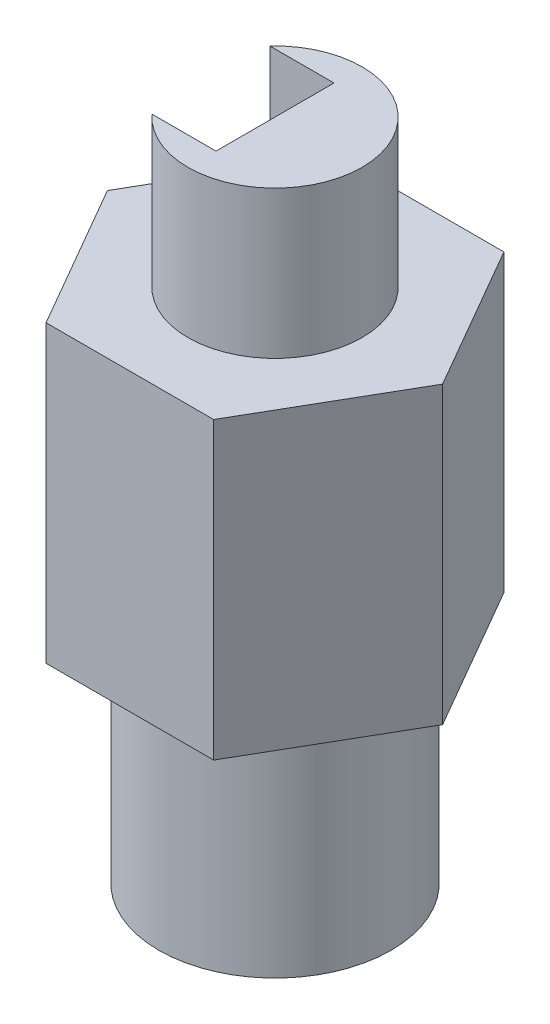
ISO-10303-21;
HEADER;
FILE_DESCRIPTION(('STEP AP214'),'2;1');
FILE_NAME('part.step','',(''),(''),'','','');
FILE_SCHEMA(('AUTOMOTIVE_DESIGN { 1 0 10303 214 1 1 1 1 }'));
ENDSEC;
DATA;
#1=APPLICATION_CONTEXT('core data for automotive mechanical design processes');
#2=APPLICATION_PROTOCOL_DEFINITION('international standard','automotive_design',2000,#1);
#3=PRODUCT_CONTEXT('',#1,'mechanical');
#4=PRODUCT('Part','Part','',(#3));
#5=PRODUCT_RELATED_PRODUCT_CATEGORY('part','',(#4));
#6=PRODUCT_DEFINITION_FORMATION('','',#4);
#7=PRODUCT_DEFINITION_CONTEXT('part definition',#1,'design');
#8=PRODUCT_DEFINITION('design','',#6,#7);
#9=PRODUCT_DEFINITION_SHAPE('','',#8);
#10=(LENGTH_UNIT() NAMED_UNIT(*) SI_UNIT(.MILLI.,.METRE.));
#11=(NAMED_UNIT(*) PLANE_ANGLE_UNIT() SI_UNIT($,.RADIAN.));
#12=(NAMED_UNIT(*) SI_UNIT($,.STERADIAN.) SOLID_ANGLE_UNIT());
#13=UNCERTAINTY_MEASURE_WITH_UNIT(LENGTH_MEASURE(1.E-05),#10,'distance_accuracy_value','');
#14=(GEOMETRIC_REPRESENTATION_CONTEXT(3) GLOBAL_UNCERTAINTY_ASSIGNED_CONTEXT((#13)) GLOBAL_UNIT_ASSIGNED_CONTEXT((#10,
#11,#12)) REPRESENTATION_CONTEXT('',''));
#15=CARTESIAN_POINT('',(0.,0.,0.));
#16=DIRECTION('',(0.,0.,1.));
#17=DIRECTION('',(1.,0.,0.));
#18=AXIS2_PLACEMENT_3D('',#15,#16,#17);
#19=CARTESIAN_POINT('',(2.88675134594813,25.6402523165195,5.));
#20=DIRECTION('',(-0.866025403784439,0.,-0.5));
#21=DIRECTION('',(-0.5,0.,0.866025403784439));
#22=AXIS2_PLACEMENT_3D('',#19,#20,#21);
#23=PLANE('',#22);
#24=DIRECTION('',(-0.5,0.,0.866025403784439));
#25=VECTOR('',#24,1.);
#26=CARTESIAN_POINT('',(2.88675134594813,5.285,5.));
#27=LINE('',#26,#25);
#28=CARTESIAN_POINT('',(5.77350269189626,5.285,0.));
#29=VERTEX_POINT('',#28);
#30=CARTESIAN_POINT('',(2.88675134594813,5.285,5.));
#31=VERTEX_POINT('',#30);
#32=EDGE_CURVE('E192',#29,#31,#27,.T.);
#33=ORIENTED_EDGE('',*,*,#32,.T.);
#34=DIRECTION('',(0.,-1.,0.));
#35=VECTOR('',#34,1.);
#36=CARTESIAN_POINT('',(2.88675134594813,25.6402523165195,5.));
#37=LINE('',#36,#35);
#38=CARTESIAN_POINT('',(2.88675134594813,-4.875,5.));
#39=VERTEX_POINT('',#38);
#40=EDGE_CURVE('E224',#31,#39,#37,.T.);
#41=ORIENTED_EDGE('',*,*,#40,.T.);
#42=DIRECTION('',(-0.5,0.,0.866025403784439));
#43=VECTOR('',#42,1.);
#44=CARTESIAN_POINT('',(2.88675134594813,-4.875,5.));
#45=LINE('',#44,#43);
#46=CARTESIAN_POINT('',(5.77350269189626,-4.875,0.));
#47=VERTEX_POINT('',#46);
#48=EDGE_CURVE('E218',#47,#39,#45,.T.);
#49=ORIENTED_EDGE('',*,*,#48,.F.);
#50=DIRECTION('',(0.,-1.,0.));
#51=VECTOR('',#50,1.);
#52=CARTESIAN_POINT('',(5.77350269189626,25.6402523165195,0.));
#53=LINE('',#52,#51);
#54=EDGE_CURVE('E225',#29,#47,#53,.T.);
#55=ORIENTED_EDGE('',*,*,#54,.F.);
#56=EDGE_LOOP('',(#33,#41,#49,#55));
#57=FACE_BOUND('',#56,.T.);
#58=ADVANCED_FACE('F47',(#57),#23,.F.);
#59=CARTESIAN_POINT('',(5.77350269189626,25.6402523165195,0.));
#60=DIRECTION('',(-0.866025403784438,0.,0.5));
#61=DIRECTION('',(0.5,0.,0.866025403784439));
#62=AXIS2_PLACEMENT_3D('',#59,#60,#61);
#63=PLANE('',#62);
#64=DIRECTION('',(0.5,0.,0.866025403784439));
#65=VECTOR('',#64,1.);
#66=CARTESIAN_POINT('',(5.77350269189626,5.285,0.));
#67=LINE('',#66,#65);
#68=CARTESIAN_POINT('',(2.88675134594813,5.285,-5.));
#69=VERTEX_POINT('',#68);
#70=EDGE_CURVE('E198',#69,#29,#67,.T.);
#71=ORIENTED_EDGE('',*,*,#70,.T.);
#72=ORIENTED_EDGE('',*,*,#54,.T.);
#73=DIRECTION('',(0.5,0.,0.866025403784439));
#74=VECTOR('',#73,1.);
#75=CARTESIAN_POINT('',(5.77350269189626,-4.875,0.));
#76=LINE('',#75,#74);
#77=CARTESIAN_POINT('',(2.88675134594813,-4.875,-5.));
#78=VERTEX_POINT('',#77);
#79=EDGE_CURVE('E221',#78,#47,#76,.T.);
#80=ORIENTED_EDGE('',*,*,#79,.F.);
#81=DIRECTION('',(0.,-1.,0.));
#82=VECTOR('',#81,1.);
#83=CARTESIAN_POINT('',(2.88675134594813,25.6402523165195,-5.));
#84=LINE('',#83,#82);
#85=EDGE_CURVE('E227',#69,#78,#84,.T.);
#86=ORIENTED_EDGE('',*,*,#85,.F.);
#87=EDGE_LOOP('',(#71,#72,#80,#86));
#88=FACE_BOUND('',#87,.T.);
#89=ADVANCED_FACE('F262',(#88),#63,.F.);
#90=CARTESIAN_POINT('',(2.88675134594813,25.6402523165195,-5.));
#91=DIRECTION('',(0.,0.,1.));
#92=DIRECTION('',(1.,0.,0.));
#93=AXIS2_PLACEMENT_3D('',#90,#91,#92);
#94=PLANE('',#93);
#95=DIRECTION('',(1.,0.,0.));
#96=VECTOR('',#95,1.);
#97=CARTESIAN_POINT('',(2.88675134594813,5.285,-5.));
#98=LINE('',#97,#96);
#99=CARTESIAN_POINT('',(-2.88675134594813,5.285,-5.));
#100=VERTEX_POINT('',#99);
#101=EDGE_CURVE('E201',#100,#69,#98,.T.);
#102=ORIENTED_EDGE('',*,*,#101,.T.);
#103=ORIENTED_EDGE('',*,*,#85,.T.);
#104=DIRECTION('',(1.,0.,0.));
#105=VECTOR('',#104,1.);
#106=CARTESIAN_POINT('',(2.88675134594813,-4.875,-5.));
#107=LINE('',#106,#105);
#108=CARTESIAN_POINT('',(-2.88675134594813,-4.875,-5.));
#109=VERTEX_POINT('',#108);
#110=EDGE_CURVE('E195',#109,#78,#107,.T.);
#111=ORIENTED_EDGE('',*,*,#110,.F.);
#112=DIRECTION('',(0.,-1.,0.));
#113=VECTOR('',#112,1.);
#114=CARTESIAN_POINT('',(-2.88675134594813,25.6402523165195,-5.));
#115=LINE('',#114,#113);
#116=EDGE_CURVE('E229',#100,#109,#115,.T.);
#117=ORIENTED_EDGE('',*,*,#116,.F.);
#118=EDGE_LOOP('',(#102,#103,#111,#117));
#119=FACE_BOUND('',#118,.T.);
#120=ADVANCED_FACE('F268',(#119),#94,.F.);
#121=CARTESIAN_POINT('',(-2.88675134594813,25.6402523165195,-5.));
#122=DIRECTION('',(0.866025403784438,0.,0.5));
#123=DIRECTION('',(0.5,0.,-0.866025403784439));
#124=AXIS2_PLACEMENT_3D('',#121,#122,#123);
#125=PLANE('',#124);
#126=DIRECTION('',(0.5,0.,-0.866025403784439));
#127=VECTOR('',#126,1.);
#128=CARTESIAN_POINT('',(-2.88675134594813,5.285,-5.));
#129=LINE('',#128,#127);
#130=CARTESIAN_POINT('',(-5.77350269189626,5.285,0.));
#131=VERTEX_POINT('',#130);
#132=EDGE_CURVE('E204',#131,#100,#129,.T.);
#133=ORIENTED_EDGE('',*,*,#132,.T.);
#134=ORIENTED_EDGE('',*,*,#116,.T.);
#135=DIRECTION('',(0.5,0.,-0.866025403784439));
#136=VECTOR('',#135,1.);
#137=CARTESIAN_POINT('',(-2.88675134594813,-4.875,-5.));
#138=LINE('',#137,#136);
#139=CARTESIAN_POINT('',(-5.77350269189626,-4.875,0.));
#140=VERTEX_POINT('',#139);
#141=EDGE_CURVE('E209',#140,#109,#138,.T.);
#142=ORIENTED_EDGE('',*,*,#141,.F.);
#143=DIRECTION('',(0.,-1.,0.));
#144=VECTOR('',#143,1.);
#145=CARTESIAN_POINT('',(-5.77350269189626,25.6402523165195,0.));
#146=LINE('',#145,#144);
#147=EDGE_CURVE('E231',#131,#140,#146,.T.);
#148=ORIENTED_EDGE('',*,*,#147,.F.);
#149=EDGE_LOOP('',(#133,#134,#142,#148));
#150=FACE_BOUND('',#149,.T.);
#151=ADVANCED_FACE('F274',(#150),#125,.F.);
#152=CARTESIAN_POINT('',(-5.77350269189626,25.6402523165195,0.));
#153=DIRECTION('',(0.866025403784439,0.,-0.5));
#154=DIRECTION('',(-0.5,0.,-0.866025403784439));
#155=AXIS2_PLACEMENT_3D('',#152,#153,#154);
#156=PLANE('',#155);
#157=DIRECTION('',(-0.5,0.,-0.866025403784439));
#158=VECTOR('',#157,1.);
#159=CARTESIAN_POINT('',(-5.77350269189626,5.285,0.));
#160=LINE('',#159,#158);
#161=CARTESIAN_POINT('',(-2.88675134594813,5.28500000000001,5.));
#162=VERTEX_POINT('',#161);
#163=EDGE_CURVE('E77',#162,#131,#160,.T.);
#164=ORIENTED_EDGE('',*,*,#163,.T.);
#165=ORIENTED_EDGE('',*,*,#147,.T.);
#166=DIRECTION('',(-0.5,0.,-0.866025403784439));
#167=VECTOR('',#166,1.);
#168=CARTESIAN_POINT('',(-5.77350269189626,-4.875,0.));
#169=LINE('',#168,#167);
#170=CARTESIAN_POINT('',(-2.88675134594813,-4.875,5.));
#171=VERTEX_POINT('',#170);
#172=EDGE_CURVE('E212',#171,#140,#169,.T.);
#173=ORIENTED_EDGE('',*,*,#172,.F.);
#174=DIRECTION('',(0.,-1.,0.));
#175=VECTOR('',#174,1.);
#176=CARTESIAN_POINT('',(-2.88675134594813,25.6402523165195,5.));
#177=LINE('',#176,#175);
#178=EDGE_CURVE('E233',#162,#171,#177,.T.);
#179=ORIENTED_EDGE('',*,*,#178,.F.);
#180=EDGE_LOOP('',(#164,#165,#173,#179));
#181=FACE_BOUND('',#180,.T.);
#182=ADVANCED_FACE('F278',(#181),#156,.F.);
#183=CARTESIAN_POINT('',(-2.88675134594813,25.6402523165195,5.));
#184=DIRECTION('',(0.,0.,-1.));
#185=DIRECTION('',(-1.,0.,0.));
#186=AXIS2_PLACEMENT_3D('',#183,#184,#185);
#187=PLANE('',#186);
#188=DIRECTION('',(-1.,0.,0.));
#189=VECTOR('',#188,1.);
#190=CARTESIAN_POINT('',(-2.88675134594813,5.285,5.));
#191=LINE('',#190,#189);
#192=EDGE_CURVE('E193',#31,#162,#191,.T.);
#193=ORIENTED_EDGE('',*,*,#192,.T.);
#194=ORIENTED_EDGE('',*,*,#178,.T.);
#195=DIRECTION('',(-1.,0.,0.));
#196=VECTOR('',#195,1.);
#197=CARTESIAN_POINT('',(-2.88675134594813,-4.875,5.));
#198=LINE('',#197,#196);
#199=EDGE_CURVE('E215',#39,#171,#198,.T.);
#200=ORIENTED_EDGE('',*,*,#199,.F.);
#201=ORIENTED_EDGE('',*,*,#40,.F.);
#202=EDGE_LOOP('',(#193,#194,#200,#201));
#203=FACE_BOUND('',#202,.T.);
#204=ADVANCED_FACE('F282',(#203),#187,.F.);
#205=CARTESIAN_POINT('',(0.,-4.875,0.));
#206=DIRECTION('',(0.,1.,0.));
#207=DIRECTION('',(0.,0.,1.));
#208=AXIS2_PLACEMENT_3D('',#205,#206,#207);
#209=PLANE('',#208);
#210=CARTESIAN_POINT('',(0.,-4.875,0.));
#211=DIRECTION('',(0.,-1.,0.));
#212=DIRECTION('',(0.,0.,-1.));
#213=AXIS2_PLACEMENT_3D('',#210,#211,#212);
#214=CIRCLE('',#213,4.);
#215=CARTESIAN_POINT('',(0.,-4.875,-4.));
#216=VERTEX_POINT('',#215);
#217=EDGE_CURVE('E12',#216,#216,#214,.T.);
#218=ORIENTED_EDGE('',*,*,#217,.F.);
#219=EDGE_LOOP('',(#218));
#220=FACE_BOUND('',#219,.T.);
#221=ORIENTED_EDGE('',*,*,#48,.T.);
#222=ORIENTED_EDGE('',*,*,#199,.T.);
#223=ORIENTED_EDGE('',*,*,#172,.T.);
#224=ORIENTED_EDGE('',*,*,#141,.T.);
#225=ORIENTED_EDGE('',*,*,#110,.T.);
#226=ORIENTED_EDGE('',*,*,#79,.T.);
#227=EDGE_LOOP('',(#221,#222,#223,#224,#225,#226));
#228=FACE_BOUND('',#227,.T.);
#229=ADVANCED_FACE('F286',(#220,#228),#209,.F.);
#230=CARTESIAN_POINT('',(0.,5.285,0.));
#231=DIRECTION('',(0.,1.,0.));
#232=DIRECTION('',(0.,0.,1.));
#233=AXIS2_PLACEMENT_3D('',#230,#231,#232);
#234=PLANE('',#233);
#235=DIRECTION('',(1.,0.,0.));
#236=VECTOR('',#235,1.);
#237=CARTESIAN_POINT('',(-14.1609873410543,5.285,-0.4445));
#238=LINE('',#237,#236);
#239=CARTESIAN_POINT('',(-2.96688721558471,5.285,-0.4445));
#240=VERTEX_POINT('',#239);
#241=CARTESIAN_POINT('',(0.,5.285,-0.4445));
#242=VERTEX_POINT('',#241);
#243=EDGE_CURVE('E180',#240,#242,#238,.T.);
#244=ORIENTED_EDGE('',*,*,#243,.F.);
#245=CARTESIAN_POINT('',(0.,5.285,0.));
#246=DIRECTION('',(0.,1.,0.));
#247=DIRECTION('',(0.,0.,1.));
#248=AXIS2_PLACEMENT_3D('',#245,#246,#247);
#249=CIRCLE('',#248,3.);
#250=CARTESIAN_POINT('',(-2.96688721558471,5.285,0.4445));
#251=VERTEX_POINT('',#250);
#252=EDGE_CURVE('E189',#240,#251,#249,.F.);
#253=ORIENTED_EDGE('',*,*,#252,.T.);
#254=DIRECTION('',(1.,0.,0.));
#255=VECTOR('',#254,1.);
#256=CARTESIAN_POINT('',(-14.1609873410543,5.285,0.4445));
#257=LINE('',#256,#255);
#258=CARTESIAN_POINT('',(0.,5.285,0.4445));
#259=VERTEX_POINT('',#258);
#260=EDGE_CURVE('E152',#251,#259,#257,.T.);
#261=ORIENTED_EDGE('',*,*,#260,.T.);
#262=DIRECTION('',(0.,0.,-1.));
#263=VECTOR('',#262,1.);
#264=CARTESIAN_POINT('',(0.,5.285,0.4445));
#265=LINE('',#264,#263);
#266=EDGE_CURVE('E159',#259,#242,#265,.T.);
#267=ORIENTED_EDGE('',*,*,#266,.T.);
#268=EDGE_LOOP('',(#244,#253,#261,#267));
#269=FACE_BOUND('',#268,.T.);
#270=ORIENTED_EDGE('',*,*,#101,.F.);
#271=ORIENTED_EDGE('',*,*,#132,.F.);
#272=ORIENTED_EDGE('',*,*,#163,.F.);
#273=ORIENTED_EDGE('',*,*,#192,.F.);
#274=ORIENTED_EDGE('',*,*,#32,.F.);
#275=ORIENTED_EDGE('',*,*,#70,.F.);
#276=EDGE_LOOP('',(#270,#271,#272,#273,#274,#275));
#277=FACE_BOUND('',#276,.T.);
#278=ADVANCED_FACE('F289',(#269,#277),#234,.T.);
#279=CARTESIAN_POINT('',(0.,-8.1712496598124,0.));
#280=DIRECTION('',(0.,1.,0.));
#281=DIRECTION('',(0.,0.,1.));
#282=AXIS2_PLACEMENT_3D('',#279,#280,#281);
#283=CYLINDRICAL_SURFACE('',#282,3.);
#284=DIRECTION('',(0.,1.,0.));
#285=VECTOR('',#284,1.);
#286=CARTESIAN_POINT('',(-2.20702877190127,-8.1712496598124,-2.032));
#287=LINE('',#286,#285);
#288=CARTESIAN_POINT('',(-2.20702877190126,10.365,-2.032));
#289=VERTEX_POINT('',#288);
#290=CARTESIAN_POINT('',(-2.20702877190126,6.8725,-2.032));
#291=VERTEX_POINT('',#290);
#292=EDGE_CURVE('E179',#289,#291,#287,.F.);
#293=ORIENTED_EDGE('',*,*,#292,.F.);
#294=CARTESIAN_POINT('',(0.,10.365,0.));
#295=DIRECTION('',(0.,1.,0.));
#296=DIRECTION('',(0.,0.,1.));
#297=AXIS2_PLACEMENT_3D('',#294,#295,#296);
#298=CIRCLE('',#297,3.);
#299=CARTESIAN_POINT('',(-2.20702877190126,10.365,2.032));
#300=VERTEX_POINT('',#299);
#301=EDGE_CURVE('E186',#300,#289,#298,.T.);
#302=ORIENTED_EDGE('',*,*,#301,.F.);
#303=DIRECTION('',(0.,1.,0.));
#304=VECTOR('',#303,1.);
#305=CARTESIAN_POINT('',(-2.20702877190127,-8.1712496598124,2.032));
#306=LINE('',#305,#304);
#307=CARTESIAN_POINT('',(-2.20702877190126,6.8725,2.032));
#308=VERTEX_POINT('',#307);
#309=EDGE_CURVE('E184',#308,#300,#306,.T.);
#310=ORIENTED_EDGE('',*,*,#309,.F.);
#311=CARTESIAN_POINT('',(-2.96688721558471,5.285,0.4445));
#312=CARTESIAN_POINT('',(-2.96037160571193,5.28499314321017,0.488047958183646));
#313=CARTESIAN_POINT('',(-2.95288210331069,5.28679152477945,0.531438293995322));
#314=CARTESIAN_POINT('',(-2.93607693229879,5.29387063793157,0.617544516347396));
#315=CARTESIAN_POINT('',(-2.9267626239757,5.29914878244151,0.660260879821429));
#316=CARTESIAN_POINT('',(-2.90648171091925,5.31301707699284,0.744467051704167));
#317=CARTESIAN_POINT('',(-2.89552557086391,5.32158675267863,0.785962768212767));
#318=CARTESIAN_POINT('',(-2.87208290461378,5.3418757503602,0.86772779369421));
#319=CARTESIAN_POINT('',(-2.85959613614175,5.35359557133136,0.907996907250129));
#320=CARTESIAN_POINT('',(-2.82018014200765,5.39315375440561,1.02638530887571));
#321=CARTESIAN_POINT('',(-2.79121968521532,5.425443193895,1.10239241300957));
#322=CARTESIAN_POINT('',(-2.72951488849794,5.50056193830292,1.24739265312568));
#323=CARTESIAN_POINT('',(-2.69676417202573,5.54340914590722,1.31637359114929));
#324=CARTESIAN_POINT('',(-2.62572298371631,5.64352543737428,1.45331747729901));
#325=CARTESIAN_POINT('',(-2.58721282023722,5.70184002291133,1.52040266022815));
#326=CARTESIAN_POINT('',(-2.51043315275164,5.82894135635848,1.64408869494391));
#327=CARTESIAN_POINT('',(-2.47216385108591,5.89773593199723,1.70068163921428));
#328=CARTESIAN_POINT('',(-2.40284177344059,6.03755360379438,1.79708344075738));
#329=CARTESIAN_POINT('',(-2.37145107440373,6.10763341134616,1.83801555945345));
#330=CARTESIAN_POINT('',(-2.3144910613003,6.25498326020619,1.90924294261172));
#331=CARTESIAN_POINT('',(-2.28889820173753,6.33222235657709,1.93958151058721));
#332=CARTESIAN_POINT('',(-2.25834498290293,6.44872659168773,1.97486451719009));
#333=CARTESIAN_POINT('',(-2.24975854848329,6.48563840539848,1.98461954942514));
#334=CARTESIAN_POINT('',(-2.23474657427793,6.560487364588,2.00150812184035));
#335=CARTESIAN_POINT('',(-2.22832023800933,6.59842412655567,2.00864262836488));
#336=CARTESIAN_POINT('',(-2.21783788901163,6.67547980453833,2.0202130412461));
#337=CARTESIAN_POINT('',(-2.21380940169504,6.71460722440402,2.02461763316284));
#338=CARTESIAN_POINT('',(-2.20839226961138,6.79331798798068,2.03051890476745));
#339=CARTESIAN_POINT('',(-2.20700751443488,6.83290191739001,2.03201129995741));
#340=CARTESIAN_POINT('',(-2.20702877190126,6.8725,2.032));
#341=B_SPLINE_CURVE_WITH_KNOTS('',3,(#311,#312,#313,#314,#315,#316,#317,#318,#319,#320,#321,
#322,#323,#324,#325,#326,#327,#328,#329,#330,#331,#332,#333,#334,#335,#336,#337,#338,#339,#340),
.UNSPECIFIED.,.F.,.F.,(4,2,2,2,2,2,2,2,2,2,2,2,2,2,4),(0.,0.132032581581834,0.263967112432617,
0.395093922941782,0.526241515872343,0.787587802359118,1.04938033781092,1.33883552999419,
1.62850799220708,1.88862957528633,2.14767505075676,2.26494225413726,2.38216617057687,
2.50071099728388,2.61943009905219),.UNSPECIFIED.);
#342=EDGE_CURVE('E149',#251,#308,#341,.T.);
#343=ORIENTED_EDGE('',*,*,#342,.F.);
#344=ORIENTED_EDGE('',*,*,#252,.F.);
#345=CARTESIAN_POINT('',(-2.20702877190126,6.8725,-2.032));
#346=CARTESIAN_POINT('',(-2.20700989991029,6.83413825161727,-2.03201006161436));
#347=CARTESIAN_POINT('',(-2.20830847243023,6.79578860374683,-2.03060992484311));
#348=CARTESIAN_POINT('',(-2.21339539747762,6.71950066398781,-2.02506940898989));
#349=CARTESIAN_POINT('',(-2.21718063334714,6.68156191752142,-2.02093246004417));
#350=CARTESIAN_POINT('',(-2.22704772313239,6.60675462490297,-2.01005183531998));
#351=CARTESIAN_POINT('',(-2.23310664368885,6.5698792257777,-2.00333417416485));
#352=CARTESIAN_POINT('',(-2.24728213415763,6.49707360333552,-1.98741969016615));
#353=CARTESIAN_POINT('',(-2.25539924721226,6.46114363227716,-1.97822221287616));
#354=CARTESIAN_POINT('',(-2.28233911189756,6.35544331197769,-1.94722235748058));
#355=CARTESIAN_POINT('',(-2.30381235069442,6.28733386715672,-1.92194775430829));
#356=CARTESIAN_POINT('',(-2.35159757968537,6.15647630260511,-1.86317554208254));
#357=CARTESIAN_POINT('',(-2.37792257535804,6.09374327315135,-1.82965574840638));
#358=CARTESIAN_POINT('',(-2.43744455987602,5.96533143250114,-1.74976948828761));
#359=CARTESIAN_POINT('',(-2.47108245794393,5.90058254606481,-1.70223748020466));
#360=CARTESIAN_POINT('',(-2.539514120938,5.77926890648767,-1.59835669841415));
#361=CARTESIAN_POINT('',(-2.57430862549097,5.7227095191665,-1.54200219401001));
#362=CARTESIAN_POINT('',(-2.64983582830443,5.60796602808715,-1.40901573241712));
#363=CARTESIAN_POINT('',(-2.6903656831274,5.55171593979793,-1.33058209774886));
#364=CARTESIAN_POINT('',(-2.76683870470497,5.45370050475981,-1.1631942413515));
#365=CARTESIAN_POINT('',(-2.8027906023047,5.41190731695561,-1.07426068860758));
#366=CARTESIAN_POINT('',(-2.84952558940845,5.36340428149183,-0.939248010599443));
#367=CARTESIAN_POINT('',(-2.86327809608848,5.35003950521277,-0.896493619219261));
#368=CARTESIAN_POINT('',(-2.88907028309881,5.32688112196938,-0.809521658296047));
#369=CARTESIAN_POINT('',(-2.9011104376144,5.3170865251706,-0.76530449802063));
#370=CARTESIAN_POINT('',(-2.92334493224225,5.30121990843803,-0.675431315937691));
#371=CARTESIAN_POINT('',(-2.93352661798524,5.29517278333107,-0.629767746162424));
#372=CARTESIAN_POINT('',(-2.95180938073897,5.28705642768041,-0.537631166016346));
#373=CARTESIAN_POINT('',(-2.95990835815968,5.28499119778964,-0.491157388861661));
#374=CARTESIAN_POINT('',(-2.96688721558471,5.285,-0.444499999999999));
#375=B_SPLINE_CURVE_WITH_KNOTS('',3,(#345,#346,#347,#348,#349,#350,#351,#352,#353,#354,#355,
#356,#357,#358,#359,#360,#361,#362,#363,#364,#365,#366,#367,#368,#369,#370,#371,#372,#373,#374),
.UNSPECIFIED.,.F.,.F.,(4,2,2,2,2,2,2,2,2,2,2,2,2,2,4),(0.,0.11501822118607,0.229892558689582,
0.343638076767743,0.457413642772676,0.683667932478933,0.910537774839735,1.17086497111126,
1.43136197123017,1.74391596752631,2.05586465277535,2.1962854400531,2.33666726591527,
2.47797193670506,2.61941850398704),.UNSPECIFIED.);
#376=EDGE_CURVE('E51',#291,#240,#375,.T.);
#377=ORIENTED_EDGE('',*,*,#376,.F.);
#378=EDGE_LOOP('',(#293,#302,#310,#343,#344,#377));
#379=FACE_BOUND('',#378,.T.);
#380=ADVANCED_FACE('F243',(#379),#283,.T.);
#381=CARTESIAN_POINT('',(0.,10.365,0.));
#382=DIRECTION('',(0.,1.,0.));
#383=DIRECTION('',(0.,0.,1.));
#384=AXIS2_PLACEMENT_3D('',#381,#382,#383);
#385=PLANE('',#384);
#386=DIRECTION('',(1.,0.,0.));
#387=VECTOR('',#386,1.);
#388=CARTESIAN_POINT('',(0.,10.365,2.032));
#389=LINE('',#388,#387);
#390=CARTESIAN_POINT('',(0.,10.365,2.032));
#391=VERTEX_POINT('',#390);
#392=EDGE_CURVE('E163',#300,#391,#389,.T.);
#393=ORIENTED_EDGE('',*,*,#392,.F.);
#394=ORIENTED_EDGE('',*,*,#301,.T.);
#395=DIRECTION('',(-1.,0.,0.));
#396=VECTOR('',#395,1.);
#397=CARTESIAN_POINT('',(0.,10.365,-2.032));
#398=LINE('',#397,#396);
#399=CARTESIAN_POINT('',(0.,10.365,-2.032));
#400=VERTEX_POINT('',#399);
#401=EDGE_CURVE('E235',#400,#289,#398,.T.);
#402=ORIENTED_EDGE('',*,*,#401,.F.);
#403=DIRECTION('',(0.,0.,1.));
#404=VECTOR('',#403,1.);
#405=CARTESIAN_POINT('',(0.,10.365,2.032));
#406=LINE('',#405,#404);
#407=EDGE_CURVE('E153',#400,#391,#406,.T.);
#408=ORIENTED_EDGE('',*,*,#407,.T.);
#409=EDGE_LOOP('',(#393,#394,#402,#408));
#410=FACE_BOUND('',#409,.T.);
#411=ADVANCED_FACE('F49',(#410),#385,.T.);
#412=CARTESIAN_POINT('',(-14.1609873410543,10.365,2.032));
#413=DIRECTION('',(0.,0.,1.));
#414=DIRECTION('',(0.,-1.,0.));
#415=AXIS2_PLACEMENT_3D('',#412,#413,#414);
#416=PLANE('',#415);
#417=ORIENTED_EDGE('',*,*,#309,.T.);
#418=ORIENTED_EDGE('',*,*,#392,.T.);
#419=DIRECTION('',(0.,-1.,0.));
#420=VECTOR('',#419,1.);
#421=CARTESIAN_POINT('',(0.,10.365,2.032));
#422=LINE('',#421,#420);
#423=CARTESIAN_POINT('',(0.,6.8725,2.032));
#424=VERTEX_POINT('',#423);
#425=EDGE_CURVE('E69',#391,#424,#422,.T.);
#426=ORIENTED_EDGE('',*,*,#425,.T.);
#427=DIRECTION('',(1.,0.,0.));
#428=VECTOR('',#427,1.);
#429=CARTESIAN_POINT('',(-14.1609873410543,6.8725,2.032));
#430=LINE('',#429,#428);
#431=EDGE_CURVE('E145',#308,#424,#430,.T.);
#432=ORIENTED_EDGE('',*,*,#431,.F.);
#433=EDGE_LOOP('',(#417,#418,#426,#432));
#434=FACE_BOUND('',#433,.T.);
#435=ADVANCED_FACE('F161',(#434),#416,.F.);
#436=CARTESIAN_POINT('',(-14.1609873410543,10.365,-2.032));
#437=DIRECTION('',(0.,0.,-1.));
#438=DIRECTION('',(0.,1.,0.));
#439=AXIS2_PLACEMENT_3D('',#436,#437,#438);
#440=PLANE('',#439);
#441=ORIENTED_EDGE('',*,*,#292,.T.);
#442=DIRECTION('',(1.,0.,0.));
#443=VECTOR('',#442,1.);
#444=CARTESIAN_POINT('',(-14.1609873410543,6.8725,-2.032));
#445=LINE('',#444,#443);
#446=CARTESIAN_POINT('',(0.,6.8725,-2.032));
#447=VERTEX_POINT('',#446);
#448=EDGE_CURVE('E177',#291,#447,#445,.T.);
#449=ORIENTED_EDGE('',*,*,#448,.T.);
#450=DIRECTION('',(0.,1.,0.));
#451=VECTOR('',#450,1.);
#452=CARTESIAN_POINT('',(0.,10.365,-2.032));
#453=LINE('',#452,#451);
#454=EDGE_CURVE('E174',#447,#400,#453,.T.);
#455=ORIENTED_EDGE('',*,*,#454,.T.);
#456=ORIENTED_EDGE('',*,*,#401,.T.);
#457=EDGE_LOOP('',(#441,#449,#455,#456));
#458=FACE_BOUND('',#457,.T.);
#459=ADVANCED_FACE('F253',(#458),#440,.F.);
#460=CARTESIAN_POINT('',(-14.1609873410543,6.8725,-0.4445));
#461=DIRECTION('',(1.,0.,0.));
#462=DIRECTION('',(0.,0.,-1.));
#463=AXIS2_PLACEMENT_3D('',#460,#461,#462);
#464=CYLINDRICAL_SURFACE('',#463,1.5875);
#465=ORIENTED_EDGE('',*,*,#376,.T.);
#466=ORIENTED_EDGE('',*,*,#243,.T.);
#467=CARTESIAN_POINT('',(0.,6.8725,-0.4445));
#468=DIRECTION('',(1.,0.,0.));
#469=DIRECTION('',(0.,0.,1.));
#470=AXIS2_PLACEMENT_3D('',#467,#468,#469);
#471=CIRCLE('',#470,1.5875);
#472=EDGE_CURVE('E171',#242,#447,#471,.T.);
#473=ORIENTED_EDGE('',*,*,#472,.T.);
#474=ORIENTED_EDGE('',*,*,#448,.F.);
#475=EDGE_LOOP('',(#465,#466,#473,#474));
#476=FACE_BOUND('',#475,.T.);
#477=ADVANCED_FACE('F249',(#476),#464,.F.);
#478=CARTESIAN_POINT('',(-14.1609873410543,6.8725,0.4445));
#479=DIRECTION('',(1.,0.,0.));
#480=DIRECTION('',(0.,0.,-1.));
#481=AXIS2_PLACEMENT_3D('',#478,#479,#480);
#482=CYLINDRICAL_SURFACE('',#481,1.5875);
#483=ORIENTED_EDGE('',*,*,#342,.T.);
#484=ORIENTED_EDGE('',*,*,#431,.T.);
#485=CARTESIAN_POINT('',(0.,6.8725,0.4445));
#486=DIRECTION('',(1.,0.,0.));
#487=DIRECTION('',(0.,0.,1.));
#488=AXIS2_PLACEMENT_3D('',#485,#486,#487);
#489=CIRCLE('',#488,1.5875);
#490=EDGE_CURVE('E147',#424,#259,#489,.T.);
#491=ORIENTED_EDGE('',*,*,#490,.T.);
#492=ORIENTED_EDGE('',*,*,#260,.F.);
#493=EDGE_LOOP('',(#483,#484,#491,#492));
#494=FACE_BOUND('',#493,.T.);
#495=ADVANCED_FACE('F146',(#494),#482,.F.);
#496=CARTESIAN_POINT('',(0.,6.8725,0.4445));
#497=DIRECTION('',(-1.,0.,0.));
#498=DIRECTION('',(0.,0.,1.));
#499=AXIS2_PLACEMENT_3D('',#496,#497,#498);
#500=PLANE('',#499);
#501=ORIENTED_EDGE('',*,*,#425,.F.);
#502=ORIENTED_EDGE('',*,*,#407,.F.);
#503=ORIENTED_EDGE('',*,*,#454,.F.);
#504=ORIENTED_EDGE('',*,*,#472,.F.);
#505=ORIENTED_EDGE('',*,*,#266,.F.);
#506=ORIENTED_EDGE('',*,*,#490,.F.);
#507=EDGE_LOOP('',(#501,#502,#503,#504,#505,#506));
#508=FACE_BOUND('',#507,.T.);
#509=ADVANCED_FACE('F156',(#508),#500,.T.);
#510=CARTESIAN_POINT('',(0.,-31.4287084989848,0.));
#511=DIRECTION('',(0.,1.,0.));
#512=DIRECTION('',(0.,0.,1.));
#513=AXIS2_PLACEMENT_3D('',#510,#511,#512);
#514=CYLINDRICAL_SURFACE('',#513,4.);
#515=CARTESIAN_POINT('',(0.,-12.495,0.));
#516=DIRECTION('',(0.,1.,0.));
#517=DIRECTION('',(0.,0.,1.));
#518=AXIS2_PLACEMENT_3D('',#515,#516,#517);
#519=CIRCLE('',#518,4.);
#520=CARTESIAN_POINT('',(0.,-12.495,4.));
#521=VERTEX_POINT('',#520);
#522=EDGE_CURVE('E165',#521,#521,#519,.T.);
#523=ORIENTED_EDGE('',*,*,#522,.T.);
#524=EDGE_LOOP('',(#523));
#525=FACE_BOUND('',#524,.T.);
#526=ORIENTED_EDGE('',*,*,#217,.T.);
#527=EDGE_LOOP('',(#526));
#528=FACE_BOUND('',#527,.T.);
#529=ADVANCED_FACE('F335',(#525,#528),#514,.T.);
#530=CARTESIAN_POINT('',(0.,-12.495,0.));
#531=DIRECTION('',(0.,1.,0.));
#532=DIRECTION('',(0.,0.,1.));
#533=AXIS2_PLACEMENT_3D('',#530,#531,#532);
#534=PLANE('',#533);
#535=ORIENTED_EDGE('',*,*,#522,.F.);
#536=EDGE_LOOP('',(#535));
#537=FACE_BOUND('',#536,.T.);
#538=ADVANCED_FACE('F344',(#537),#534,.F.);
#539=CLOSED_SHELL('',(#58,#89,#120,#151,#182,#204,#229,#278,#380,#411,#435,#459,#477,#495,#509,
#529,#538));
#540=MANIFOLD_SOLID_BREP('B2',#539);
#541=ADVANCED_BREP_SHAPE_REPRESENTATION('',(#18,#540),#14);
#542=SHAPE_DEFINITION_REPRESENTATION(#9,#541);
ENDSEC;
END-ISO-10303-21;
